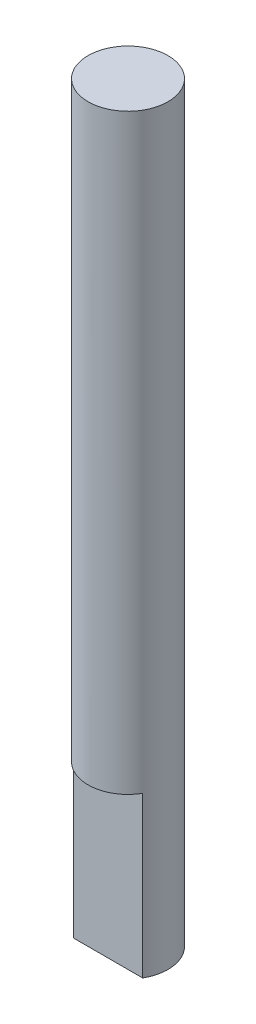
ISO-10303-21;
HEADER;
FILE_DESCRIPTION(('STEP AP214'),'2;1');
FILE_NAME('part.step','',(''),(''),'','','');
FILE_SCHEMA(('AUTOMOTIVE_DESIGN { 1 0 10303 214 1 1 1 1 }'));
ENDSEC;
DATA;
#1=APPLICATION_CONTEXT('core data for automotive mechanical design processes');
#2=APPLICATION_PROTOCOL_DEFINITION('international standard','automotive_design',2000,#1);
#3=PRODUCT_CONTEXT('',#1,'mechanical');
#4=PRODUCT('Part','Part','',(#3));
#5=PRODUCT_RELATED_PRODUCT_CATEGORY('part','',(#4));
#6=PRODUCT_DEFINITION_FORMATION('','',#4);
#7=PRODUCT_DEFINITION_CONTEXT('part definition',#1,'design');
#8=PRODUCT_DEFINITION('design','',#6,#7);
#9=PRODUCT_DEFINITION_SHAPE('','',#8);
#10=(LENGTH_UNIT() NAMED_UNIT(*) SI_UNIT(.MILLI.,.METRE.));
#11=(NAMED_UNIT(*) PLANE_ANGLE_UNIT() SI_UNIT($,.RADIAN.));
#12=(NAMED_UNIT(*) SI_UNIT($,.STERADIAN.) SOLID_ANGLE_UNIT());
#13=UNCERTAINTY_MEASURE_WITH_UNIT(LENGTH_MEASURE(1.E-05),#10,'distance_accuracy_value','');
#14=(GEOMETRIC_REPRESENTATION_CONTEXT(3) GLOBAL_UNCERTAINTY_ASSIGNED_CONTEXT((#13)) GLOBAL_UNIT_ASSIGNED_CONTEXT((#10,
#11,#12)) REPRESENTATION_CONTEXT('',''));
#15=CARTESIAN_POINT('',(0.,0.,0.));
#16=DIRECTION('',(0.,0.,1.));
#17=DIRECTION('',(1.,0.,0.));
#18=AXIS2_PLACEMENT_3D('',#15,#16,#17);
#19=CARTESIAN_POINT('',(0.,94.,0.));
#20=DIRECTION('',(0.,-1.,0.));
#21=DIRECTION('',(0.,0.,-1.));
#22=AXIS2_PLACEMENT_3D('',#19,#20,#21);
#23=CYLINDRICAL_SURFACE('',#22,5.);
#24=CARTESIAN_POINT('',(0.,94.,0.));
#25=DIRECTION('',(0.,1.,0.));
#26=DIRECTION('',(0.,0.,1.));
#27=AXIS2_PLACEMENT_3D('',#24,#25,#26);
#28=CIRCLE('',#27,5.);
#29=CARTESIAN_POINT('',(0.,94.,5.));
#30=VERTEX_POINT('',#29);
#31=EDGE_CURVE('E70',#30,#30,#28,.T.);
#32=ORIENTED_EDGE('',*,*,#31,.F.);
#33=EDGE_LOOP('',(#32));
#34=FACE_BOUND('',#33,.T.);
#35=CARTESIAN_POINT('',(0.,20.,0.));
#36=DIRECTION('',(0.,1.,0.));
#37=DIRECTION('',(0.,0.,1.));
#38=AXIS2_PLACEMENT_3D('',#35,#36,#37);
#39=CIRCLE('',#38,5.);
#40=CARTESIAN_POINT('',(-4.33012701892219,20.,2.5));
#41=VERTEX_POINT('',#40);
#42=CARTESIAN_POINT('',(4.33012701892219,20.,2.5));
#43=VERTEX_POINT('',#42);
#44=EDGE_CURVE('E11',#41,#43,#39,.T.);
#45=ORIENTED_EDGE('',*,*,#44,.T.);
#46=DIRECTION('',(0.,-1.,0.));
#47=VECTOR('',#46,1.);
#48=CARTESIAN_POINT('',(4.33012701892219,94.,2.5));
#49=LINE('',#48,#47);
#50=CARTESIAN_POINT('',(4.33012701892219,0.,2.5));
#51=VERTEX_POINT('',#50);
#52=EDGE_CURVE('E59',#43,#51,#49,.T.);
#53=ORIENTED_EDGE('',*,*,#52,.T.);
#54=CARTESIAN_POINT('',(0.,0.,0.));
#55=DIRECTION('',(0.,1.,0.));
#56=DIRECTION('',(0.,0.,1.));
#57=AXIS2_PLACEMENT_3D('',#54,#55,#56);
#58=CIRCLE('',#57,5.);
#59=CARTESIAN_POINT('',(-4.33012701892219,0.,2.5));
#60=VERTEX_POINT('',#59);
#61=EDGE_CURVE('E72',#51,#60,#58,.T.);
#62=ORIENTED_EDGE('',*,*,#61,.T.);
#63=DIRECTION('',(0.,-1.,0.));
#64=VECTOR('',#63,1.);
#65=CARTESIAN_POINT('',(-4.33012701892219,94.,2.5));
#66=LINE('',#65,#64);
#67=EDGE_CURVE('E54',#60,#41,#66,.F.);
#68=ORIENTED_EDGE('',*,*,#67,.T.);
#69=EDGE_LOOP('',(#45,#53,#62,#68));
#70=FACE_BOUND('',#69,.T.);
#71=ADVANCED_FACE('F39',(#34,#70),#23,.T.);
#72=CARTESIAN_POINT('',(0.,94.,0.));
#73=DIRECTION('',(0.,1.,0.));
#74=DIRECTION('',(0.,0.,1.));
#75=AXIS2_PLACEMENT_3D('',#72,#73,#74);
#76=PLANE('',#75);
#77=ORIENTED_EDGE('',*,*,#31,.T.);
#78=EDGE_LOOP('',(#77));
#79=FACE_BOUND('',#78,.T.);
#80=ADVANCED_FACE('F95',(#79),#76,.T.);
#81=CARTESIAN_POINT('',(0.,0.,0.));
#82=DIRECTION('',(0.,1.,0.));
#83=DIRECTION('',(0.,0.,1.));
#84=AXIS2_PLACEMENT_3D('',#81,#82,#83);
#85=PLANE('',#84);
#86=ORIENTED_EDGE('',*,*,#61,.F.);
#87=DIRECTION('',(-1.,0.,0.));
#88=VECTOR('',#87,1.);
#89=CARTESIAN_POINT('',(0.,0.,2.5));
#90=LINE('',#89,#88);
#91=EDGE_CURVE('E47',#51,#60,#90,.T.);
#92=ORIENTED_EDGE('',*,*,#91,.T.);
#93=EDGE_LOOP('',(#86,#92));
#94=FACE_BOUND('',#93,.T.);
#95=ADVANCED_FACE('F75',(#94),#85,.F.);
#96=CARTESIAN_POINT('',(0.,20.,0.));
#97=DIRECTION('',(0.,1.,0.));
#98=DIRECTION('',(0.,0.,1.));
#99=AXIS2_PLACEMENT_3D('',#96,#97,#98);
#100=PLANE('',#99);
#101=DIRECTION('',(1.,0.,0.));
#102=VECTOR('',#101,1.);
#103=CARTESIAN_POINT('',(5.48125230015624,20.,2.5));
#104=LINE('',#103,#102);
#105=EDGE_CURVE('E84',#41,#43,#104,.T.);
#106=ORIENTED_EDGE('',*,*,#105,.T.);
#107=ORIENTED_EDGE('',*,*,#44,.F.);
#108=EDGE_LOOP('',(#106,#107));
#109=FACE_BOUND('',#108,.T.);
#110=ADVANCED_FACE('F87',(#109),#100,.F.);
#111=CARTESIAN_POINT('',(5.48125230015624,20.,2.5));
#112=DIRECTION('',(0.,0.,-1.));
#113=DIRECTION('',(-1.,0.,0.));
#114=AXIS2_PLACEMENT_3D('',#111,#112,#113);
#115=PLANE('',#114);
#116=ORIENTED_EDGE('',*,*,#105,.F.);
#117=ORIENTED_EDGE('',*,*,#67,.F.);
#118=ORIENTED_EDGE('',*,*,#91,.F.);
#119=ORIENTED_EDGE('',*,*,#52,.F.);
#120=EDGE_LOOP('',(#116,#117,#118,#119));
#121=FACE_BOUND('',#120,.T.);
#122=ADVANCED_FACE('F65',(#121),#115,.F.);
#123=CLOSED_SHELL('',(#71,#80,#95,#110,#122));
#124=MANIFOLD_SOLID_BREP('B2',#123);
#125=ADVANCED_BREP_SHAPE_REPRESENTATION('',(#18,#124),#14);
#126=SHAPE_DEFINITION_REPRESENTATION(#9,#125);
ENDSEC;
END-ISO-10303-21;
